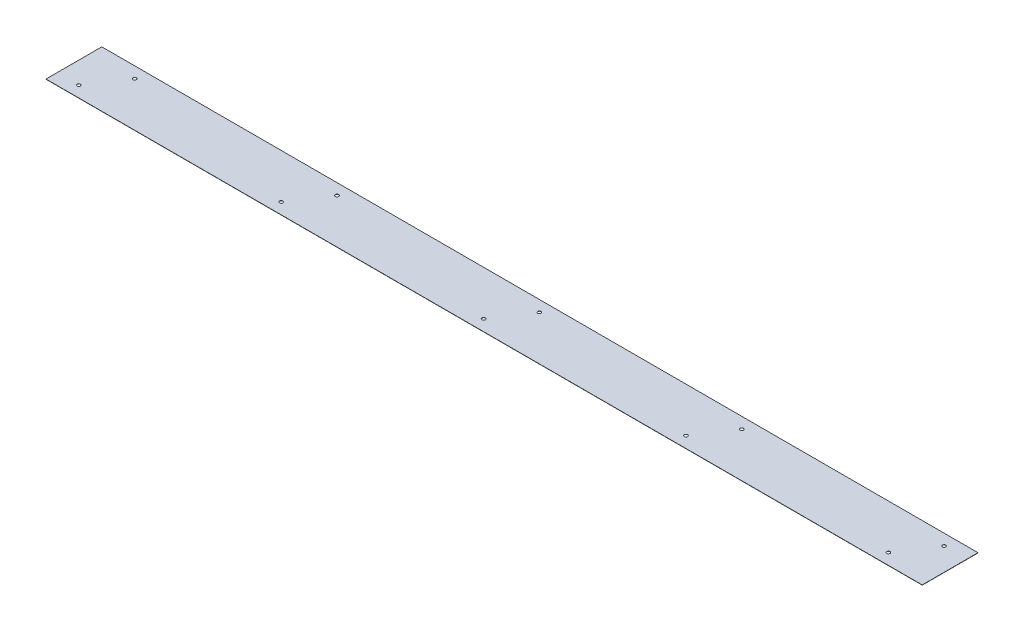
ISO-10303-21;
HEADER;
FILE_DESCRIPTION(('STEP AP214'),'2;1');
FILE_NAME('part.step','',(''),(''),'','','');
FILE_SCHEMA(('AUTOMOTIVE_DESIGN { 1 0 10303 214 1 1 1 1 }'));
ENDSEC;
DATA;
#1=APPLICATION_CONTEXT('core data for automotive mechanical design processes');
#2=APPLICATION_PROTOCOL_DEFINITION('international standard','automotive_design',2000,#1);
#3=PRODUCT_CONTEXT('',#1,'mechanical');
#4=PRODUCT('Part','Part','',(#3));
#5=PRODUCT_RELATED_PRODUCT_CATEGORY('part','',(#4));
#6=PRODUCT_DEFINITION_FORMATION('','',#4);
#7=PRODUCT_DEFINITION_CONTEXT('part definition',#1,'design');
#8=PRODUCT_DEFINITION('design','',#6,#7);
#9=PRODUCT_DEFINITION_SHAPE('','',#8);
#10=(LENGTH_UNIT() NAMED_UNIT(*) SI_UNIT(.MILLI.,.METRE.));
#11=(NAMED_UNIT(*) PLANE_ANGLE_UNIT() SI_UNIT($,.RADIAN.));
#12=(NAMED_UNIT(*) SI_UNIT($,.STERADIAN.) SOLID_ANGLE_UNIT());
#13=UNCERTAINTY_MEASURE_WITH_UNIT(LENGTH_MEASURE(1.E-05),#10,'distance_accuracy_value','');
#14=(GEOMETRIC_REPRESENTATION_CONTEXT(3) GLOBAL_UNCERTAINTY_ASSIGNED_CONTEXT((#13)) GLOBAL_UNIT_ASSIGNED_CONTEXT((#10,
#11,#12)) REPRESENTATION_CONTEXT('',''));
#15=CARTESIAN_POINT('',(0.,0.,0.));
#16=DIRECTION('',(0.,0.,1.));
#17=DIRECTION('',(1.,0.,0.));
#18=AXIS2_PLACEMENT_3D('',#15,#16,#17);
#19=CARTESIAN_POINT('',(0.,0.2,0.));
#20=DIRECTION('',(0.,-1.,0.));
#21=DIRECTION('',(0.,0.,-1.));
#22=AXIS2_PLACEMENT_3D('',#19,#20,#21);
#23=PLANE('',#22);
#24=CARTESIAN_POINT('',(745.037732803921,0.2,-10.));
#25=DIRECTION('',(0.,1.,0.));
#26=DIRECTION('',(0.,0.,1.));
#27=AXIS2_PLACEMENT_3D('',#24,#25,#26);
#28=CIRCLE('',#27,1.49999999999997);
#29=CARTESIAN_POINT('',(745.037732803921,0.2,-8.50000000000003));
#30=VERTEX_POINT('',#29);
#31=EDGE_CURVE('E141',#30,#30,#28,.T.);
#32=ORIENTED_EDGE('',*,*,#31,.F.);
#33=EDGE_LOOP('',(#32));
#34=FACE_BOUND('',#33,.T.);
#35=CARTESIAN_POINT('',(563.637732803921,0.2,-10.));
#36=DIRECTION('',(0.,1.,0.));
#37=DIRECTION('',(0.,0.,1.));
#38=AXIS2_PLACEMENT_3D('',#35,#36,#37);
#39=CIRCLE('',#38,1.49999999999997);
#40=CARTESIAN_POINT('',(563.637732803921,0.2,-8.50000000000003));
#41=VERTEX_POINT('',#40);
#42=EDGE_CURVE('E135',#41,#41,#39,.T.);
#43=ORIENTED_EDGE('',*,*,#42,.F.);
#44=EDGE_LOOP('',(#43));
#45=FACE_BOUND('',#44,.T.);
#46=CARTESIAN_POINT('',(382.237732803921,0.2,-10.));
#47=DIRECTION('',(0.,1.,0.));
#48=DIRECTION('',(0.,0.,1.));
#49=AXIS2_PLACEMENT_3D('',#46,#47,#48);
#50=CIRCLE('',#49,1.50000000000002);
#51=CARTESIAN_POINT('',(382.237732803921,0.2,-8.49999999999998));
#52=VERTEX_POINT('',#51);
#53=EDGE_CURVE('E127',#52,#52,#50,.T.);
#54=ORIENTED_EDGE('',*,*,#53,.F.);
#55=EDGE_LOOP('',(#54));
#56=FACE_BOUND('',#55,.T.);
#57=CARTESIAN_POINT('',(200.837732803921,0.2,-10.));
#58=DIRECTION('',(0.,1.,0.));
#59=DIRECTION('',(0.,0.,1.));
#60=AXIS2_PLACEMENT_3D('',#57,#58,#59);
#61=CIRCLE('',#60,1.5);
#62=CARTESIAN_POINT('',(200.837732803921,0.2,-8.5));
#63=VERTEX_POINT('',#62);
#64=EDGE_CURVE('E119',#63,#63,#61,.T.);
#65=ORIENTED_EDGE('',*,*,#64,.F.);
#66=EDGE_LOOP('',(#65));
#67=FACE_BOUND('',#66,.T.);
#68=CARTESIAN_POINT('',(19.437732803921,0.2,-10.));
#69=DIRECTION('',(0.,1.,0.));
#70=DIRECTION('',(0.,0.,1.));
#71=AXIS2_PLACEMENT_3D('',#68,#69,#70);
#72=CIRCLE('',#71,1.5);
#73=CARTESIAN_POINT('',(19.437732803921,0.2,-8.5));
#74=VERTEX_POINT('',#73);
#75=EDGE_CURVE('E111',#74,#74,#72,.T.);
#76=ORIENTED_EDGE('',*,*,#75,.F.);
#77=EDGE_LOOP('',(#76));
#78=FACE_BOUND('',#77,.T.);
#79=DIRECTION('',(0.,0.,1.));
#80=VECTOR('',#79,1.);
#81=CARTESIAN_POINT('',(0.,0.2,0.));
#82=LINE('',#81,#80);
#83=CARTESIAN_POINT('',(0.,0.2,-50.));
#84=VERTEX_POINT('',#83);
#85=CARTESIAN_POINT('',(0.,0.2,0.));
#86=VERTEX_POINT('',#85);
#87=EDGE_CURVE('E87',#84,#86,#82,.T.);
#88=ORIENTED_EDGE('',*,*,#87,.T.);
#89=DIRECTION('',(1.,0.,0.));
#90=VECTOR('',#89,1.);
#91=CARTESIAN_POINT('',(0.,0.2,0.));
#92=LINE('',#91,#90);
#93=CARTESIAN_POINT('',(785.4,0.2,0.));
#94=VERTEX_POINT('',#93);
#95=EDGE_CURVE('E82',#86,#94,#92,.T.);
#96=ORIENTED_EDGE('',*,*,#95,.T.);
#97=DIRECTION('',(0.,0.,-1.));
#98=VECTOR('',#97,1.);
#99=CARTESIAN_POINT('',(785.4,0.2,0.));
#100=LINE('',#99,#98);
#101=CARTESIAN_POINT('',(785.4,0.2,-50.));
#102=VERTEX_POINT('',#101);
#103=EDGE_CURVE('E85',#94,#102,#100,.T.);
#104=ORIENTED_EDGE('',*,*,#103,.T.);
#105=DIRECTION('',(-1.,0.,0.));
#106=VECTOR('',#105,1.);
#107=CARTESIAN_POINT('',(0.,0.2,-50.));
#108=LINE('',#107,#106);
#109=EDGE_CURVE('E52',#102,#84,#108,.T.);
#110=ORIENTED_EDGE('',*,*,#109,.T.);
#111=EDGE_LOOP('',(#88,#96,#104,#110));
#112=FACE_BOUND('',#111,.T.);
#113=CARTESIAN_POINT('',(39.437732803921,0.2,-40.));
#114=DIRECTION('',(0.,1.,0.));
#115=DIRECTION('',(0.,0.,1.));
#116=AXIS2_PLACEMENT_3D('',#113,#114,#115);
#117=CIRCLE('',#116,1.5);
#118=CARTESIAN_POINT('',(39.437732803921,0.2,-38.5));
#119=VERTEX_POINT('',#118);
#120=EDGE_CURVE('E115',#119,#119,#117,.T.);
#121=ORIENTED_EDGE('',*,*,#120,.F.);
#122=EDGE_LOOP('',(#121));
#123=FACE_BOUND('',#122,.T.);
#124=CARTESIAN_POINT('',(220.837732803921,0.2,-40.));
#125=DIRECTION('',(0.,1.,0.));
#126=DIRECTION('',(0.,0.,1.));
#127=AXIS2_PLACEMENT_3D('',#124,#125,#126);
#128=CIRCLE('',#127,1.5);
#129=CARTESIAN_POINT('',(220.837732803921,0.2,-38.5));
#130=VERTEX_POINT('',#129);
#131=EDGE_CURVE('E123',#130,#130,#128,.T.);
#132=ORIENTED_EDGE('',*,*,#131,.F.);
#133=EDGE_LOOP('',(#132));
#134=FACE_BOUND('',#133,.T.);
#135=CARTESIAN_POINT('',(402.237732803921,0.2,-40.));
#136=DIRECTION('',(0.,1.,0.));
#137=DIRECTION('',(0.,0.,1.));
#138=AXIS2_PLACEMENT_3D('',#135,#136,#137);
#139=CIRCLE('',#138,1.49999999999997);
#140=CARTESIAN_POINT('',(402.237732803921,0.2,-38.5000000000001));
#141=VERTEX_POINT('',#140);
#142=EDGE_CURVE('E131',#141,#141,#139,.T.);
#143=ORIENTED_EDGE('',*,*,#142,.F.);
#144=EDGE_LOOP('',(#143));
#145=FACE_BOUND('',#144,.T.);
#146=CARTESIAN_POINT('',(583.637732803921,0.2,-40.));
#147=DIRECTION('',(0.,1.,0.));
#148=DIRECTION('',(0.,0.,1.));
#149=AXIS2_PLACEMENT_3D('',#146,#147,#148);
#150=CIRCLE('',#149,1.50000000000008);
#151=CARTESIAN_POINT('',(583.637732803921,0.2,-38.5));
#152=VERTEX_POINT('',#151);
#153=EDGE_CURVE('E138',#152,#152,#150,.T.);
#154=ORIENTED_EDGE('',*,*,#153,.F.);
#155=EDGE_LOOP('',(#154));
#156=FACE_BOUND('',#155,.T.);
#157=CARTESIAN_POINT('',(765.037732803921,0.2,-40.));
#158=DIRECTION('',(0.,1.,0.));
#159=DIRECTION('',(0.,0.,1.));
#160=AXIS2_PLACEMENT_3D('',#157,#158,#159);
#161=CIRCLE('',#160,1.50000000000008);
#162=CARTESIAN_POINT('',(765.037732803921,0.2,-38.5));
#163=VERTEX_POINT('',#162);
#164=EDGE_CURVE('E151',#163,#163,#161,.T.);
#165=ORIENTED_EDGE('',*,*,#164,.F.);
#166=EDGE_LOOP('',(#165));
#167=FACE_BOUND('',#166,.T.);
#168=ADVANCED_FACE('F33',(#34,#45,#56,#67,#78,#112,#123,#134,#145,#156,#167),#23,.F.);
#169=CARTESIAN_POINT('',(0.,0.,0.));
#170=DIRECTION('',(0.,-1.,0.));
#171=DIRECTION('',(0.,0.,-1.));
#172=AXIS2_PLACEMENT_3D('',#169,#170,#171);
#173=PLANE('',#172);
#174=CARTESIAN_POINT('',(745.037732803921,0.,-10.));
#175=DIRECTION('',(0.,-1.,0.));
#176=DIRECTION('',(0.,0.,-1.));
#177=AXIS2_PLACEMENT_3D('',#174,#175,#176);
#178=CIRCLE('',#177,1.49999999999997);
#179=CARTESIAN_POINT('',(745.037732803921,0.,-11.5));
#180=VERTEX_POINT('',#179);
#181=EDGE_CURVE('E139',#180,#180,#178,.F.);
#182=ORIENTED_EDGE('',*,*,#181,.T.);
#183=EDGE_LOOP('',(#182));
#184=FACE_BOUND('',#183,.T.);
#185=CARTESIAN_POINT('',(563.637732803921,0.,-10.));
#186=DIRECTION('',(0.,-1.,0.));
#187=DIRECTION('',(0.,0.,-1.));
#188=AXIS2_PLACEMENT_3D('',#185,#186,#187);
#189=CIRCLE('',#188,1.49999999999997);
#190=CARTESIAN_POINT('',(563.637732803921,0.,-11.5));
#191=VERTEX_POINT('',#190);
#192=EDGE_CURVE('E132',#191,#191,#189,.F.);
#193=ORIENTED_EDGE('',*,*,#192,.T.);
#194=EDGE_LOOP('',(#193));
#195=FACE_BOUND('',#194,.T.);
#196=CARTESIAN_POINT('',(382.237732803921,0.,-10.));
#197=DIRECTION('',(0.,-1.,0.));
#198=DIRECTION('',(0.,0.,-1.));
#199=AXIS2_PLACEMENT_3D('',#196,#197,#198);
#200=CIRCLE('',#199,1.50000000000002);
#201=CARTESIAN_POINT('',(382.237732803921,0.,-11.5));
#202=VERTEX_POINT('',#201);
#203=EDGE_CURVE('E124',#202,#202,#200,.F.);
#204=ORIENTED_EDGE('',*,*,#203,.T.);
#205=EDGE_LOOP('',(#204));
#206=FACE_BOUND('',#205,.T.);
#207=CARTESIAN_POINT('',(200.837732803921,0.,-10.));
#208=DIRECTION('',(0.,-1.,0.));
#209=DIRECTION('',(0.,0.,-1.));
#210=AXIS2_PLACEMENT_3D('',#207,#208,#209);
#211=CIRCLE('',#210,1.5);
#212=CARTESIAN_POINT('',(200.837732803921,0.,-11.5));
#213=VERTEX_POINT('',#212);
#214=EDGE_CURVE('E116',#213,#213,#211,.F.);
#215=ORIENTED_EDGE('',*,*,#214,.T.);
#216=EDGE_LOOP('',(#215));
#217=FACE_BOUND('',#216,.T.);
#218=CARTESIAN_POINT('',(19.437732803921,0.,-10.));
#219=DIRECTION('',(0.,-1.,0.));
#220=DIRECTION('',(0.,0.,-1.));
#221=AXIS2_PLACEMENT_3D('',#218,#219,#220);
#222=CIRCLE('',#221,1.5);
#223=CARTESIAN_POINT('',(19.437732803921,0.,-11.5));
#224=VERTEX_POINT('',#223);
#225=EDGE_CURVE('E103',#224,#224,#222,.F.);
#226=ORIENTED_EDGE('',*,*,#225,.T.);
#227=EDGE_LOOP('',(#226));
#228=FACE_BOUND('',#227,.T.);
#229=DIRECTION('',(0.,0.,1.));
#230=VECTOR('',#229,1.);
#231=CARTESIAN_POINT('',(0.,0.,0.));
#232=LINE('',#231,#230);
#233=CARTESIAN_POINT('',(0.,0.,-50.));
#234=VERTEX_POINT('',#233);
#235=CARTESIAN_POINT('',(0.,0.,0.));
#236=VERTEX_POINT('',#235);
#237=EDGE_CURVE('E100',#234,#236,#232,.T.);
#238=ORIENTED_EDGE('',*,*,#237,.F.);
#239=DIRECTION('',(-1.,0.,0.));
#240=VECTOR('',#239,1.);
#241=CARTESIAN_POINT('',(0.,0.,-50.));
#242=LINE('',#241,#240);
#243=CARTESIAN_POINT('',(785.4,0.,-50.));
#244=VERTEX_POINT('',#243);
#245=EDGE_CURVE('E75',#244,#234,#242,.T.);
#246=ORIENTED_EDGE('',*,*,#245,.F.);
#247=DIRECTION('',(0.,0.,-1.));
#248=VECTOR('',#247,1.);
#249=CARTESIAN_POINT('',(785.4,0.,0.));
#250=LINE('',#249,#248);
#251=CARTESIAN_POINT('',(785.4,0.,0.));
#252=VERTEX_POINT('',#251);
#253=EDGE_CURVE('E69',#252,#244,#250,.T.);
#254=ORIENTED_EDGE('',*,*,#253,.F.);
#255=DIRECTION('',(1.,0.,0.));
#256=VECTOR('',#255,1.);
#257=CARTESIAN_POINT('',(0.,0.,0.));
#258=LINE('',#257,#256);
#259=EDGE_CURVE('E91',#236,#252,#258,.T.);
#260=ORIENTED_EDGE('',*,*,#259,.F.);
#261=EDGE_LOOP('',(#238,#246,#254,#260));
#262=FACE_BOUND('',#261,.T.);
#263=CARTESIAN_POINT('',(39.437732803921,0.,-40.));
#264=DIRECTION('',(0.,-1.,0.));
#265=DIRECTION('',(0.,0.,-1.));
#266=AXIS2_PLACEMENT_3D('',#263,#264,#265);
#267=CIRCLE('',#266,1.5);
#268=CARTESIAN_POINT('',(39.437732803921,0.,-41.5));
#269=VERTEX_POINT('',#268);
#270=EDGE_CURVE('E112',#269,#269,#267,.F.);
#271=ORIENTED_EDGE('',*,*,#270,.T.);
#272=EDGE_LOOP('',(#271));
#273=FACE_BOUND('',#272,.T.);
#274=CARTESIAN_POINT('',(220.837732803921,0.,-40.));
#275=DIRECTION('',(0.,-1.,0.));
#276=DIRECTION('',(0.,0.,-1.));
#277=AXIS2_PLACEMENT_3D('',#274,#275,#276);
#278=CIRCLE('',#277,1.5);
#279=CARTESIAN_POINT('',(220.837732803921,0.,-41.5));
#280=VERTEX_POINT('',#279);
#281=EDGE_CURVE('E120',#280,#280,#278,.F.);
#282=ORIENTED_EDGE('',*,*,#281,.T.);
#283=EDGE_LOOP('',(#282));
#284=FACE_BOUND('',#283,.T.);
#285=CARTESIAN_POINT('',(402.237732803921,0.,-40.));
#286=DIRECTION('',(0.,-1.,0.));
#287=DIRECTION('',(0.,0.,-1.));
#288=AXIS2_PLACEMENT_3D('',#285,#286,#287);
#289=CIRCLE('',#288,1.49999999999997);
#290=CARTESIAN_POINT('',(402.237732803921,0.,-41.5));
#291=VERTEX_POINT('',#290);
#292=EDGE_CURVE('E128',#291,#291,#289,.F.);
#293=ORIENTED_EDGE('',*,*,#292,.T.);
#294=EDGE_LOOP('',(#293));
#295=FACE_BOUND('',#294,.T.);
#296=CARTESIAN_POINT('',(583.637732803921,0.,-40.));
#297=DIRECTION('',(0.,-1.,0.));
#298=DIRECTION('',(0.,0.,-1.));
#299=AXIS2_PLACEMENT_3D('',#296,#297,#298);
#300=CIRCLE('',#299,1.50000000000008);
#301=CARTESIAN_POINT('',(583.637732803921,0.,-41.5000000000001));
#302=VERTEX_POINT('',#301);
#303=EDGE_CURVE('E136',#302,#302,#300,.F.);
#304=ORIENTED_EDGE('',*,*,#303,.T.);
#305=EDGE_LOOP('',(#304));
#306=FACE_BOUND('',#305,.T.);
#307=CARTESIAN_POINT('',(765.037732803921,0.,-40.));
#308=DIRECTION('',(0.,-1.,0.));
#309=DIRECTION('',(0.,0.,-1.));
#310=AXIS2_PLACEMENT_3D('',#307,#308,#309);
#311=CIRCLE('',#310,1.50000000000008);
#312=CARTESIAN_POINT('',(765.037732803921,0.,-41.5000000000001));
#313=VERTEX_POINT('',#312);
#314=EDGE_CURVE('E37',#313,#313,#311,.F.);
#315=ORIENTED_EDGE('',*,*,#314,.T.);
#316=EDGE_LOOP('',(#315));
#317=FACE_BOUND('',#316,.T.);
#318=ADVANCED_FACE('F172',(#184,#195,#206,#217,#228,#262,#273,#284,#295,#306,#317),#173,.T.);
#319=CARTESIAN_POINT('',(0.,0.2,0.));
#320=DIRECTION('',(1.,0.,0.));
#321=DIRECTION('',(0.,0.,-1.));
#322=AXIS2_PLACEMENT_3D('',#319,#320,#321);
#323=PLANE('',#322);
#324=ORIENTED_EDGE('',*,*,#237,.T.);
#325=DIRECTION('',(0.,-1.,0.));
#326=VECTOR('',#325,1.);
#327=CARTESIAN_POINT('',(0.,0.2,0.));
#328=LINE('',#327,#326);
#329=EDGE_CURVE('E11',#86,#236,#328,.T.);
#330=ORIENTED_EDGE('',*,*,#329,.F.);
#331=ORIENTED_EDGE('',*,*,#87,.F.);
#332=DIRECTION('',(0.,-1.,0.));
#333=VECTOR('',#332,1.);
#334=CARTESIAN_POINT('',(0.,0.2,-50.));
#335=LINE('',#334,#333);
#336=EDGE_CURVE('E96',#84,#234,#335,.T.);
#337=ORIENTED_EDGE('',*,*,#336,.T.);
#338=EDGE_LOOP('',(#324,#330,#331,#337));
#339=FACE_BOUND('',#338,.T.);
#340=ADVANCED_FACE('F35',(#339),#323,.F.);
#341=CARTESIAN_POINT('',(0.,0.2,0.));
#342=DIRECTION('',(0.,0.,-1.));
#343=DIRECTION('',(-1.,0.,0.));
#344=AXIS2_PLACEMENT_3D('',#341,#342,#343);
#345=PLANE('',#344);
#346=ORIENTED_EDGE('',*,*,#259,.T.);
#347=DIRECTION('',(0.,-1.,0.));
#348=VECTOR('',#347,1.);
#349=CARTESIAN_POINT('',(785.4,0.2,0.));
#350=LINE('',#349,#348);
#351=EDGE_CURVE('E43',#94,#252,#350,.T.);
#352=ORIENTED_EDGE('',*,*,#351,.F.);
#353=ORIENTED_EDGE('',*,*,#95,.F.);
#354=ORIENTED_EDGE('',*,*,#329,.T.);
#355=EDGE_LOOP('',(#346,#352,#353,#354));
#356=FACE_BOUND('',#355,.T.);
#357=ADVANCED_FACE('F90',(#356),#345,.F.);
#358=CARTESIAN_POINT('',(785.4,0.2,0.));
#359=DIRECTION('',(-1.,0.,0.));
#360=DIRECTION('',(0.,0.,1.));
#361=AXIS2_PLACEMENT_3D('',#358,#359,#360);
#362=PLANE('',#361);
#363=ORIENTED_EDGE('',*,*,#253,.T.);
#364=DIRECTION('',(0.,-1.,0.));
#365=VECTOR('',#364,1.);
#366=CARTESIAN_POINT('',(785.4,0.2,-50.));
#367=LINE('',#366,#365);
#368=EDGE_CURVE('E92',#102,#244,#367,.T.);
#369=ORIENTED_EDGE('',*,*,#368,.F.);
#370=ORIENTED_EDGE('',*,*,#103,.F.);
#371=ORIENTED_EDGE('',*,*,#351,.T.);
#372=EDGE_LOOP('',(#363,#369,#370,#371));
#373=FACE_BOUND('',#372,.T.);
#374=ADVANCED_FACE('F94',(#373),#362,.F.);
#375=CARTESIAN_POINT('',(0.,0.2,-50.));
#376=DIRECTION('',(0.,0.,1.));
#377=DIRECTION('',(1.,0.,0.));
#378=AXIS2_PLACEMENT_3D('',#375,#376,#377);
#379=PLANE('',#378);
#380=ORIENTED_EDGE('',*,*,#245,.T.);
#381=ORIENTED_EDGE('',*,*,#336,.F.);
#382=ORIENTED_EDGE('',*,*,#109,.F.);
#383=ORIENTED_EDGE('',*,*,#368,.T.);
#384=EDGE_LOOP('',(#380,#381,#382,#383));
#385=FACE_BOUND('',#384,.T.);
#386=ADVANCED_FACE('F183',(#385),#379,.F.);
#387=CARTESIAN_POINT('',(19.437732803921,0.2,-10.));
#388=DIRECTION('',(0.,-1.,0.));
#389=DIRECTION('',(0.,0.,-1.));
#390=AXIS2_PLACEMENT_3D('',#387,#388,#389);
#391=CYLINDRICAL_SURFACE('',#390,1.5);
#392=ORIENTED_EDGE('',*,*,#225,.F.);
#393=EDGE_LOOP('',(#392));
#394=FACE_BOUND('',#393,.T.);
#395=ORIENTED_EDGE('',*,*,#75,.T.);
#396=EDGE_LOOP('',(#395));
#397=FACE_BOUND('',#396,.T.);
#398=ADVANCED_FACE('F169',(#394,#397),#391,.F.);
#399=CARTESIAN_POINT('',(39.437732803921,0.2,-40.));
#400=DIRECTION('',(0.,-1.,0.));
#401=DIRECTION('',(0.,0.,-1.));
#402=AXIS2_PLACEMENT_3D('',#399,#400,#401);
#403=CYLINDRICAL_SURFACE('',#402,1.5);
#404=ORIENTED_EDGE('',*,*,#270,.F.);
#405=EDGE_LOOP('',(#404));
#406=FACE_BOUND('',#405,.T.);
#407=ORIENTED_EDGE('',*,*,#120,.T.);
#408=EDGE_LOOP('',(#407));
#409=FACE_BOUND('',#408,.T.);
#410=ADVANCED_FACE('F243',(#406,#409),#403,.F.);
#411=CARTESIAN_POINT('',(200.837732803921,0.2,-10.));
#412=DIRECTION('',(0.,-1.,0.));
#413=DIRECTION('',(0.,0.,-1.));
#414=AXIS2_PLACEMENT_3D('',#411,#412,#413);
#415=CYLINDRICAL_SURFACE('',#414,1.5);
#416=ORIENTED_EDGE('',*,*,#214,.F.);
#417=EDGE_LOOP('',(#416));
#418=FACE_BOUND('',#417,.T.);
#419=ORIENTED_EDGE('',*,*,#64,.T.);
#420=EDGE_LOOP('',(#419));
#421=FACE_BOUND('',#420,.T.);
#422=ADVANCED_FACE('F240',(#418,#421),#415,.F.);
#423=CARTESIAN_POINT('',(220.837732803921,0.2,-40.));
#424=DIRECTION('',(0.,-1.,0.));
#425=DIRECTION('',(0.,0.,-1.));
#426=AXIS2_PLACEMENT_3D('',#423,#424,#425);
#427=CYLINDRICAL_SURFACE('',#426,1.5);
#428=ORIENTED_EDGE('',*,*,#281,.F.);
#429=EDGE_LOOP('',(#428));
#430=FACE_BOUND('',#429,.T.);
#431=ORIENTED_EDGE('',*,*,#131,.T.);
#432=EDGE_LOOP('',(#431));
#433=FACE_BOUND('',#432,.T.);
#434=ADVANCED_FACE('F236',(#430,#433),#427,.F.);
#435=CARTESIAN_POINT('',(382.237732803921,0.2,-10.));
#436=DIRECTION('',(0.,-1.,0.));
#437=DIRECTION('',(0.,0.,-1.));
#438=AXIS2_PLACEMENT_3D('',#435,#436,#437);
#439=CYLINDRICAL_SURFACE('',#438,1.50000000000002);
#440=ORIENTED_EDGE('',*,*,#203,.F.);
#441=EDGE_LOOP('',(#440));
#442=FACE_BOUND('',#441,.T.);
#443=ORIENTED_EDGE('',*,*,#53,.T.);
#444=EDGE_LOOP('',(#443));
#445=FACE_BOUND('',#444,.T.);
#446=ADVANCED_FACE('F232',(#442,#445),#439,.F.);
#447=CARTESIAN_POINT('',(402.237732803921,0.2,-40.));
#448=DIRECTION('',(0.,-1.,0.));
#449=DIRECTION('',(0.,0.,-1.));
#450=AXIS2_PLACEMENT_3D('',#447,#448,#449);
#451=CYLINDRICAL_SURFACE('',#450,1.49999999999997);
#452=ORIENTED_EDGE('',*,*,#292,.F.);
#453=EDGE_LOOP('',(#452));
#454=FACE_BOUND('',#453,.T.);
#455=ORIENTED_EDGE('',*,*,#142,.T.);
#456=EDGE_LOOP('',(#455));
#457=FACE_BOUND('',#456,.T.);
#458=ADVANCED_FACE('F228',(#454,#457),#451,.F.);
#459=CARTESIAN_POINT('',(563.637732803921,0.2,-10.));
#460=DIRECTION('',(0.,-1.,0.));
#461=DIRECTION('',(0.,0.,-1.));
#462=AXIS2_PLACEMENT_3D('',#459,#460,#461);
#463=CYLINDRICAL_SURFACE('',#462,1.49999999999997);
#464=ORIENTED_EDGE('',*,*,#192,.F.);
#465=EDGE_LOOP('',(#464));
#466=FACE_BOUND('',#465,.T.);
#467=ORIENTED_EDGE('',*,*,#42,.T.);
#468=EDGE_LOOP('',(#467));
#469=FACE_BOUND('',#468,.T.);
#470=ADVANCED_FACE('F224',(#466,#469),#463,.F.);
#471=CARTESIAN_POINT('',(583.637732803921,0.2,-40.));
#472=DIRECTION('',(0.,-1.,0.));
#473=DIRECTION('',(0.,0.,-1.));
#474=AXIS2_PLACEMENT_3D('',#471,#472,#473);
#475=CYLINDRICAL_SURFACE('',#474,1.50000000000008);
#476=ORIENTED_EDGE('',*,*,#303,.F.);
#477=EDGE_LOOP('',(#476));
#478=FACE_BOUND('',#477,.T.);
#479=ORIENTED_EDGE('',*,*,#153,.T.);
#480=EDGE_LOOP('',(#479));
#481=FACE_BOUND('',#480,.T.);
#482=ADVANCED_FACE('F218',(#478,#481),#475,.F.);
#483=CARTESIAN_POINT('',(745.037732803921,0.2,-10.));
#484=DIRECTION('',(0.,-1.,0.));
#485=DIRECTION('',(0.,0.,-1.));
#486=AXIS2_PLACEMENT_3D('',#483,#484,#485);
#487=CYLINDRICAL_SURFACE('',#486,1.49999999999997);
#488=ORIENTED_EDGE('',*,*,#181,.F.);
#489=EDGE_LOOP('',(#488));
#490=FACE_BOUND('',#489,.T.);
#491=ORIENTED_EDGE('',*,*,#31,.T.);
#492=EDGE_LOOP('',(#491));
#493=FACE_BOUND('',#492,.T.);
#494=ADVANCED_FACE('F210',(#490,#493),#487,.F.);
#495=CARTESIAN_POINT('',(765.037732803921,0.2,-40.));
#496=DIRECTION('',(0.,-1.,0.));
#497=DIRECTION('',(0.,0.,-1.));
#498=AXIS2_PLACEMENT_3D('',#495,#496,#497);
#499=CYLINDRICAL_SURFACE('',#498,1.50000000000008);
#500=ORIENTED_EDGE('',*,*,#314,.F.);
#501=EDGE_LOOP('',(#500));
#502=FACE_BOUND('',#501,.T.);
#503=ORIENTED_EDGE('',*,*,#164,.T.);
#504=EDGE_LOOP('',(#503));
#505=FACE_BOUND('',#504,.T.);
#506=ADVANCED_FACE('F207',(#502,#505),#499,.F.);
#507=CLOSED_SHELL('',(#168,#318,#340,#357,#374,#386,#398,#410,#422,#434,#446,#458,#470,#482,
#494,#506));
#508=MANIFOLD_SOLID_BREP('B2',#507);
#509=ADVANCED_BREP_SHAPE_REPRESENTATION('',(#18,#508),#14);
#510=SHAPE_DEFINITION_REPRESENTATION(#9,#509);
ENDSEC;
END-ISO-10303-21;
